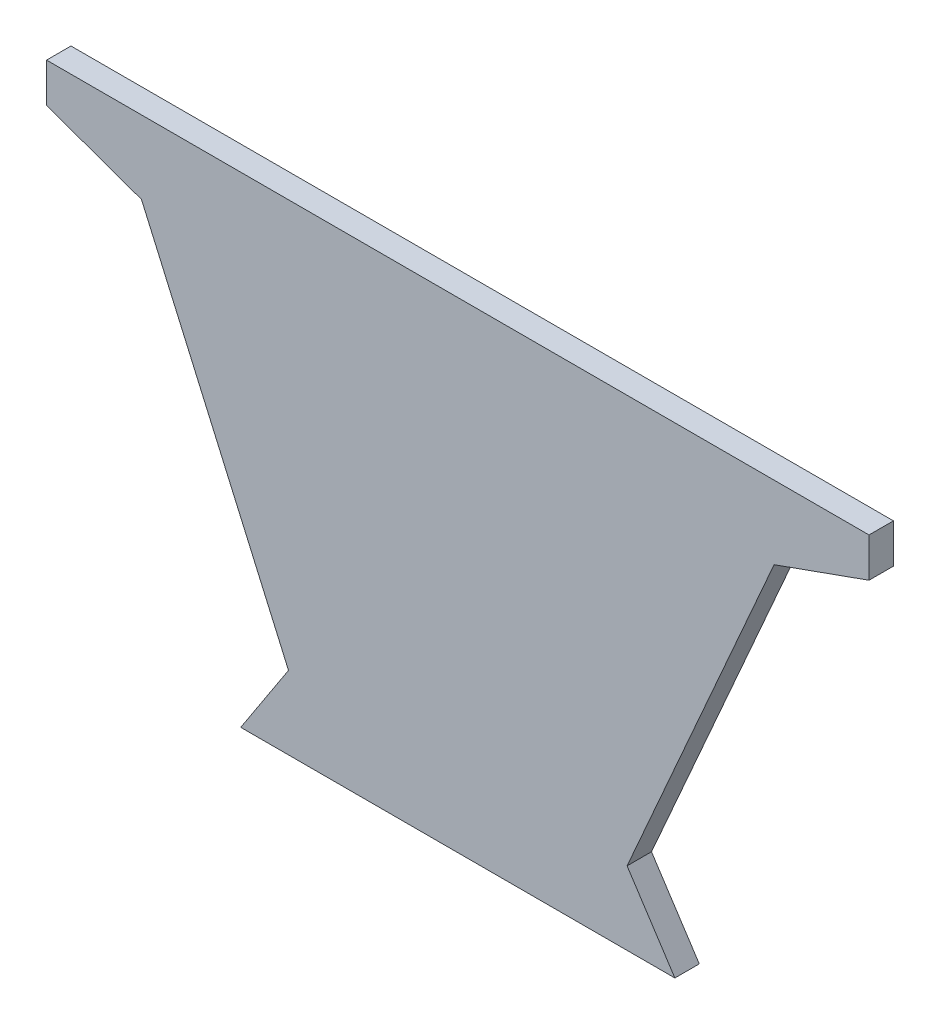
ISO-10303-21;
HEADER;
FILE_DESCRIPTION(('STEP AP214'),'2;1');
FILE_NAME('part.step','',(''),(''),'','','');
FILE_SCHEMA(('AUTOMOTIVE_DESIGN { 1 0 10303 214 1 1 1 1 }'));
ENDSEC;
DATA;
#1=APPLICATION_CONTEXT('core data for automotive mechanical design processes');
#2=APPLICATION_PROTOCOL_DEFINITION('international standard','automotive_design',2000,#1);
#3=PRODUCT_CONTEXT('',#1,'mechanical');
#4=PRODUCT('Part','Part','',(#3));
#5=PRODUCT_RELATED_PRODUCT_CATEGORY('part','',(#4));
#6=PRODUCT_DEFINITION_FORMATION('','',#4);
#7=PRODUCT_DEFINITION_CONTEXT('part definition',#1,'design');
#8=PRODUCT_DEFINITION('design','',#6,#7);
#9=PRODUCT_DEFINITION_SHAPE('','',#8);
#10=(LENGTH_UNIT() NAMED_UNIT(*) SI_UNIT(.MILLI.,.METRE.));
#11=(NAMED_UNIT(*) PLANE_ANGLE_UNIT() SI_UNIT($,.RADIAN.));
#12=(NAMED_UNIT(*) SI_UNIT($,.STERADIAN.) SOLID_ANGLE_UNIT());
#13=UNCERTAINTY_MEASURE_WITH_UNIT(LENGTH_MEASURE(1.E-05),#10,'distance_accuracy_value','');
#14=(GEOMETRIC_REPRESENTATION_CONTEXT(3) GLOBAL_UNCERTAINTY_ASSIGNED_CONTEXT((#13)) GLOBAL_UNIT_ASSIGNED_CONTEXT((#10,
#11,#12)) REPRESENTATION_CONTEXT('',''));
#15=CARTESIAN_POINT('',(0.,0.,0.));
#16=DIRECTION('',(0.,0.,1.));
#17=DIRECTION('',(1.,0.,0.));
#18=AXIS2_PLACEMENT_3D('',#15,#16,#17);
#19=CARTESIAN_POINT('',(0.,0.,5.));
#20=DIRECTION('',(0.,0.,1.));
#21=DIRECTION('',(1.,0.,0.));
#22=AXIS2_PLACEMENT_3D('',#19,#20,#21);
#23=PLANE('',#22);
#24=DIRECTION('',(0.402524691548119,-0.915409128583549,0.));
#25=VECTOR('',#24,1.);
#26=CARTESIAN_POINT('',(-41.6839180394226,-18.3292974992485,5.));
#27=LINE('',#26,#25);
#28=CARTESIAN_POINT('',(-64.8041435722949,34.25,5.));
#29=VERTEX_POINT('',#28);
#30=CARTESIAN_POINT('',(-34.6832495260328,-34.25,5.));
#31=VERTEX_POINT('',#30);
#32=EDGE_CURVE('E120',#29,#31,#27,.T.);
#33=ORIENTED_EDGE('',*,*,#32,.T.);
#34=DIRECTION('',(-0.54656898395897,-0.837414082622247,0.));
#35=VECTOR('',#34,1.);
#36=CARTESIAN_POINT('',(-8.64567559469956,5.64291695529728,5.));
#37=LINE('',#36,#35);
#38=CARTESIAN_POINT('',(-44.4735491275298,-49.25,5.));
#39=VERTEX_POINT('',#38);
#40=EDGE_CURVE('E113',#31,#39,#37,.T.);
#41=ORIENTED_EDGE('',*,*,#40,.T.);
#42=DIRECTION('',(1.,0.,0.));
#43=VECTOR('',#42,1.);
#44=CARTESIAN_POINT('',(-44.4735491275298,-49.25,5.));
#45=LINE('',#44,#43);
#46=CARTESIAN_POINT('',(44.4735491275299,-49.25,5.));
#47=VERTEX_POINT('',#46);
#48=EDGE_CURVE('E148',#39,#47,#45,.T.);
#49=ORIENTED_EDGE('',*,*,#48,.T.);
#50=DIRECTION('',(-0.54656898395897,0.837414082622247,0.));
#51=VECTOR('',#50,1.);
#52=CARTESIAN_POINT('',(8.64567559469958,5.64291695529731,5.));
#53=LINE('',#52,#51);
#54=CARTESIAN_POINT('',(34.6832495260329,-34.25,5.));
#55=VERTEX_POINT('',#54);
#56=EDGE_CURVE('E182',#47,#55,#53,.T.);
#57=ORIENTED_EDGE('',*,*,#56,.T.);
#58=DIRECTION('',(0.402524691548119,0.915409128583549,0.));
#59=VECTOR('',#58,1.);
#60=CARTESIAN_POINT('',(41.6839180394226,-18.3292974992485,5.));
#61=LINE('',#60,#59);
#62=CARTESIAN_POINT('',(64.804143572295,34.25,5.));
#63=VERTEX_POINT('',#62);
#64=EDGE_CURVE('E187',#55,#63,#61,.T.);
#65=ORIENTED_EDGE('',*,*,#64,.T.);
#66=DIRECTION('',(0.94153595264122,0.336912525567082,0.));
#67=VECTOR('',#66,1.);
#68=CARTESIAN_POINT('',(-3.50870093871182,9.805417816695,5.));
#69=LINE('',#68,#67);
#70=CARTESIAN_POINT('',(84.25,41.2083668924107,5.));
#71=VERTEX_POINT('',#70);
#72=EDGE_CURVE('E178',#63,#71,#69,.T.);
#73=ORIENTED_EDGE('',*,*,#72,.T.);
#74=DIRECTION('',(0.,1.,0.));
#75=VECTOR('',#74,1.);
#76=CARTESIAN_POINT('',(84.25,41.2083668924107,5.));
#77=LINE('',#76,#75);
#78=CARTESIAN_POINT('',(84.25,49.25,5.));
#79=VERTEX_POINT('',#78);
#80=EDGE_CURVE('E201',#71,#79,#77,.T.);
#81=ORIENTED_EDGE('',*,*,#80,.T.);
#82=DIRECTION('',(-1.,0.,0.));
#83=VECTOR('',#82,1.);
#84=CARTESIAN_POINT('',(84.25,49.25,5.));
#85=LINE('',#84,#83);
#86=CARTESIAN_POINT('',(-84.25,49.25,5.));
#87=VERTEX_POINT('',#86);
#88=EDGE_CURVE('E70',#79,#87,#85,.T.);
#89=ORIENTED_EDGE('',*,*,#88,.T.);
#90=DIRECTION('',(0.,-1.,0.));
#91=VECTOR('',#90,1.);
#92=CARTESIAN_POINT('',(-84.25,49.25,5.));
#93=LINE('',#92,#91);
#94=CARTESIAN_POINT('',(-84.25,41.2083668924108,5.));
#95=VERTEX_POINT('',#94);
#96=EDGE_CURVE('E96',#87,#95,#93,.T.);
#97=ORIENTED_EDGE('',*,*,#96,.T.);
#98=DIRECTION('',(0.94153595264122,-0.336912525567083,0.));
#99=VECTOR('',#98,1.);
#100=CARTESIAN_POINT('',(3.5087009387118,9.80541781669491,5.));
#101=LINE('',#100,#99);
#102=EDGE_CURVE('E191',#95,#29,#101,.T.);
#103=ORIENTED_EDGE('',*,*,#102,.T.);
#104=EDGE_LOOP('',(#33,#41,#49,#57,#65,#73,#81,#89,#97,#103));
#105=FACE_BOUND('',#104,.T.);
#106=ADVANCED_FACE('F45',(#105),#23,.T.);
#107=CARTESIAN_POINT('',(0.,0.,0.));
#108=DIRECTION('',(0.,0.,1.));
#109=DIRECTION('',(1.,0.,0.));
#110=AXIS2_PLACEMENT_3D('',#107,#108,#109);
#111=PLANE('',#110);
#112=DIRECTION('',(0.54656898395897,0.837414082622247,0.));
#113=VECTOR('',#112,1.);
#114=CARTESIAN_POINT('',(-8.64567559469956,5.64291695529728,0.));
#115=LINE('',#114,#113);
#116=CARTESIAN_POINT('',(-44.4735491275298,-49.25,0.));
#117=VERTEX_POINT('',#116);
#118=CARTESIAN_POINT('',(-34.6832495260328,-34.25,0.));
#119=VERTEX_POINT('',#118);
#120=EDGE_CURVE('E157',#117,#119,#115,.T.);
#121=ORIENTED_EDGE('',*,*,#120,.T.);
#122=DIRECTION('',(-0.402524691548119,0.915409128583548,0.));
#123=VECTOR('',#122,1.);
#124=CARTESIAN_POINT('',(-41.6839180394226,-18.3292974992485,0.));
#125=LINE('',#124,#123);
#126=CARTESIAN_POINT('',(-64.8041435722949,34.25,0.));
#127=VERTEX_POINT('',#126);
#128=EDGE_CURVE('E240',#119,#127,#125,.T.);
#129=ORIENTED_EDGE('',*,*,#128,.T.);
#130=DIRECTION('',(-0.94153595264122,0.336912525567083,0.));
#131=VECTOR('',#130,1.);
#132=CARTESIAN_POINT('',(3.5087009387118,9.80541781669491,0.));
#133=LINE('',#132,#131);
#134=CARTESIAN_POINT('',(-84.25,41.2083668924108,0.));
#135=VERTEX_POINT('',#134);
#136=EDGE_CURVE('E110',#127,#135,#133,.T.);
#137=ORIENTED_EDGE('',*,*,#136,.T.);
#138=DIRECTION('',(0.,-1.,0.));
#139=VECTOR('',#138,1.);
#140=CARTESIAN_POINT('',(-84.25,49.25,0.));
#141=LINE('',#140,#139);
#142=CARTESIAN_POINT('',(-84.25,49.25,0.));
#143=VERTEX_POINT('',#142);
#144=EDGE_CURVE('E102',#143,#135,#141,.T.);
#145=ORIENTED_EDGE('',*,*,#144,.F.);
#146=DIRECTION('',(-1.,0.,0.));
#147=VECTOR('',#146,1.);
#148=CARTESIAN_POINT('',(84.25,49.25,0.));
#149=LINE('',#148,#147);
#150=CARTESIAN_POINT('',(84.25,49.25,0.));
#151=VERTEX_POINT('',#150);
#152=EDGE_CURVE('E85',#151,#143,#149,.T.);
#153=ORIENTED_EDGE('',*,*,#152,.F.);
#154=DIRECTION('',(0.,1.,0.));
#155=VECTOR('',#154,1.);
#156=CARTESIAN_POINT('',(84.25,41.2083668924107,0.));
#157=LINE('',#156,#155);
#158=CARTESIAN_POINT('',(84.25,41.2083668924107,0.));
#159=VERTEX_POINT('',#158);
#160=EDGE_CURVE('E97',#159,#151,#157,.T.);
#161=ORIENTED_EDGE('',*,*,#160,.F.);
#162=DIRECTION('',(-0.94153595264122,-0.336912525567082,0.));
#163=VECTOR('',#162,1.);
#164=CARTESIAN_POINT('',(-3.50870093871182,9.805417816695,0.));
#165=LINE('',#164,#163);
#166=CARTESIAN_POINT('',(64.804143572295,34.25,0.));
#167=VERTEX_POINT('',#166);
#168=EDGE_CURVE('E167',#159,#167,#165,.T.);
#169=ORIENTED_EDGE('',*,*,#168,.T.);
#170=DIRECTION('',(-0.402524691548119,-0.915409128583549,0.));
#171=VECTOR('',#170,1.);
#172=CARTESIAN_POINT('',(41.6839180394226,-18.3292974992485,0.));
#173=LINE('',#172,#171);
#174=CARTESIAN_POINT('',(34.6832495260329,-34.25,0.));
#175=VERTEX_POINT('',#174);
#176=EDGE_CURVE('E61',#167,#175,#173,.T.);
#177=ORIENTED_EDGE('',*,*,#176,.T.);
#178=DIRECTION('',(0.54656898395897,-0.837414082622247,0.));
#179=VECTOR('',#178,1.);
#180=CARTESIAN_POINT('',(8.64567559469958,5.64291695529731,0.));
#181=LINE('',#180,#179);
#182=CARTESIAN_POINT('',(44.4735491275299,-49.25,0.));
#183=VERTEX_POINT('',#182);
#184=EDGE_CURVE('E159',#175,#183,#181,.T.);
#185=ORIENTED_EDGE('',*,*,#184,.T.);
#186=DIRECTION('',(1.,0.,0.));
#187=VECTOR('',#186,1.);
#188=CARTESIAN_POINT('',(-44.4735491275298,-49.25,0.));
#189=LINE('',#188,#187);
#190=EDGE_CURVE('E112',#117,#183,#189,.T.);
#191=ORIENTED_EDGE('',*,*,#190,.F.);
#192=EDGE_LOOP('',(#121,#129,#137,#145,#153,#161,#169,#177,#185,#191));
#193=FACE_BOUND('',#192,.T.);
#194=ADVANCED_FACE('F107',(#193),#111,.F.);
#195=CARTESIAN_POINT('',(-84.25,49.25,5.));
#196=DIRECTION('',(1.,0.,0.));
#197=DIRECTION('',(0.,0.,-1.));
#198=AXIS2_PLACEMENT_3D('',#195,#196,#197);
#199=PLANE('',#198);
#200=ORIENTED_EDGE('',*,*,#144,.T.);
#201=DIRECTION('',(0.,0.,-1.));
#202=VECTOR('',#201,1.);
#203=CARTESIAN_POINT('',(-84.25,41.2083668924108,5.));
#204=LINE('',#203,#202);
#205=EDGE_CURVE('E11',#95,#135,#204,.T.);
#206=ORIENTED_EDGE('',*,*,#205,.F.);
#207=ORIENTED_EDGE('',*,*,#96,.F.);
#208=DIRECTION('',(0.,0.,-1.));
#209=VECTOR('',#208,1.);
#210=CARTESIAN_POINT('',(-84.25,49.25,5.));
#211=LINE('',#210,#209);
#212=EDGE_CURVE('E88',#87,#143,#211,.T.);
#213=ORIENTED_EDGE('',*,*,#212,.T.);
#214=EDGE_LOOP('',(#200,#206,#207,#213));
#215=FACE_BOUND('',#214,.T.);
#216=ADVANCED_FACE('F47',(#215),#199,.F.);
#217=CARTESIAN_POINT('',(-44.4735491275298,-49.25,5.));
#218=DIRECTION('',(0.,1.,0.));
#219=DIRECTION('',(0.,0.,1.));
#220=AXIS2_PLACEMENT_3D('',#217,#218,#219);
#221=PLANE('',#220);
#222=ORIENTED_EDGE('',*,*,#190,.T.);
#223=DIRECTION('',(0.,0.,-1.));
#224=VECTOR('',#223,1.);
#225=CARTESIAN_POINT('',(44.4735491275299,-49.25,5.));
#226=LINE('',#225,#224);
#227=EDGE_CURVE('E133',#47,#183,#226,.T.);
#228=ORIENTED_EDGE('',*,*,#227,.F.);
#229=ORIENTED_EDGE('',*,*,#48,.F.);
#230=DIRECTION('',(0.,0.,-1.));
#231=VECTOR('',#230,1.);
#232=CARTESIAN_POINT('',(-44.4735491275298,-49.25,5.));
#233=LINE('',#232,#231);
#234=EDGE_CURVE('E54',#39,#117,#233,.T.);
#235=ORIENTED_EDGE('',*,*,#234,.T.);
#236=EDGE_LOOP('',(#222,#228,#229,#235));
#237=FACE_BOUND('',#236,.T.);
#238=ADVANCED_FACE('F143',(#237),#221,.F.);
#239=CARTESIAN_POINT('',(84.25,41.2083668924107,5.));
#240=DIRECTION('',(-1.,0.,0.));
#241=DIRECTION('',(0.,0.,1.));
#242=AXIS2_PLACEMENT_3D('',#239,#240,#241);
#243=PLANE('',#242);
#244=ORIENTED_EDGE('',*,*,#160,.T.);
#245=DIRECTION('',(0.,0.,-1.));
#246=VECTOR('',#245,1.);
#247=CARTESIAN_POINT('',(84.25,49.25,5.));
#248=LINE('',#247,#246);
#249=EDGE_CURVE('E91',#79,#151,#248,.T.);
#250=ORIENTED_EDGE('',*,*,#249,.F.);
#251=ORIENTED_EDGE('',*,*,#80,.F.);
#252=DIRECTION('',(0.,0.,-1.));
#253=VECTOR('',#252,1.);
#254=CARTESIAN_POINT('',(84.25,41.2083668924107,5.));
#255=LINE('',#254,#253);
#256=EDGE_CURVE('E129',#71,#159,#255,.T.);
#257=ORIENTED_EDGE('',*,*,#256,.T.);
#258=EDGE_LOOP('',(#244,#250,#251,#257));
#259=FACE_BOUND('',#258,.T.);
#260=ADVANCED_FACE('F208',(#259),#243,.F.);
#261=CARTESIAN_POINT('',(84.25,49.25,5.));
#262=DIRECTION('',(0.,-1.,0.));
#263=DIRECTION('',(1.,0.,0.));
#264=AXIS2_PLACEMENT_3D('',#261,#262,#263);
#265=PLANE('',#264);
#266=ORIENTED_EDGE('',*,*,#152,.T.);
#267=ORIENTED_EDGE('',*,*,#212,.F.);
#268=ORIENTED_EDGE('',*,*,#88,.F.);
#269=ORIENTED_EDGE('',*,*,#249,.T.);
#270=EDGE_LOOP('',(#266,#267,#268,#269));
#271=FACE_BOUND('',#270,.T.);
#272=ADVANCED_FACE('F87',(#271),#265,.F.);
#273=CARTESIAN_POINT('',(41.6839180394226,-18.3292974992485,10.));
#274=DIRECTION('',(0.915409128583549,-0.402524691548119,0.));
#275=DIRECTION('',(0.402524691548119,0.915409128583549,0.));
#276=AXIS2_PLACEMENT_3D('',#273,#274,#275);
#277=PLANE('',#276);
#278=DIRECTION('',(0.,0.,-1.));
#279=VECTOR('',#278,1.);
#280=CARTESIAN_POINT('',(34.6832495260329,-34.25,10.));
#281=LINE('',#280,#279);
#282=EDGE_CURVE('E171',#55,#175,#281,.T.);
#283=ORIENTED_EDGE('',*,*,#282,.T.);
#284=ORIENTED_EDGE('',*,*,#176,.F.);
#285=DIRECTION('',(0.,0.,-1.));
#286=VECTOR('',#285,1.);
#287=CARTESIAN_POINT('',(64.804143572295,34.25,10.));
#288=LINE('',#287,#286);
#289=EDGE_CURVE('E166',#63,#167,#288,.T.);
#290=ORIENTED_EDGE('',*,*,#289,.F.);
#291=ORIENTED_EDGE('',*,*,#64,.F.);
#292=EDGE_LOOP('',(#283,#284,#290,#291));
#293=FACE_BOUND('',#292,.T.);
#294=ADVANCED_FACE('F270',(#293),#277,.T.);
#295=CARTESIAN_POINT('',(8.64567559469958,5.64291695529731,10.));
#296=DIRECTION('',(0.837414082622247,0.54656898395897,0.));
#297=DIRECTION('',(-0.54656898395897,0.837414082622247,0.));
#298=AXIS2_PLACEMENT_3D('',#295,#296,#297);
#299=PLANE('',#298);
#300=ORIENTED_EDGE('',*,*,#227,.T.);
#301=ORIENTED_EDGE('',*,*,#184,.F.);
#302=ORIENTED_EDGE('',*,*,#282,.F.);
#303=ORIENTED_EDGE('',*,*,#56,.F.);
#304=EDGE_LOOP('',(#300,#301,#302,#303));
#305=FACE_BOUND('',#304,.T.);
#306=ADVANCED_FACE('F305',(#305),#299,.T.);
#307=CARTESIAN_POINT('',(-3.50870093871182,9.805417816695,10.));
#308=DIRECTION('',(0.336912525567082,-0.94153595264122,0.));
#309=DIRECTION('',(0.94153595264122,0.336912525567082,0.));
#310=AXIS2_PLACEMENT_3D('',#307,#308,#309);
#311=PLANE('',#310);
#312=ORIENTED_EDGE('',*,*,#289,.T.);
#313=ORIENTED_EDGE('',*,*,#168,.F.);
#314=ORIENTED_EDGE('',*,*,#256,.F.);
#315=ORIENTED_EDGE('',*,*,#72,.F.);
#316=EDGE_LOOP('',(#312,#313,#314,#315));
#317=FACE_BOUND('',#316,.T.);
#318=ADVANCED_FACE('F313',(#317),#311,.T.);
#319=CARTESIAN_POINT('',(-8.64567559469956,5.64291695529728,10.));
#320=DIRECTION('',(-0.837414082622247,0.54656898395897,0.));
#321=DIRECTION('',(-0.54656898395897,-0.837414082622247,0.));
#322=AXIS2_PLACEMENT_3D('',#319,#320,#321);
#323=PLANE('',#322);
#324=DIRECTION('',(0.,0.,-1.));
#325=VECTOR('',#324,1.);
#326=CARTESIAN_POINT('',(-34.6832495260328,-34.25,10.));
#327=LINE('',#326,#325);
#328=EDGE_CURVE('E183',#31,#119,#327,.T.);
#329=ORIENTED_EDGE('',*,*,#328,.T.);
#330=ORIENTED_EDGE('',*,*,#120,.F.);
#331=ORIENTED_EDGE('',*,*,#234,.F.);
#332=ORIENTED_EDGE('',*,*,#40,.F.);
#333=EDGE_LOOP('',(#329,#330,#331,#332));
#334=FACE_BOUND('',#333,.T.);
#335=ADVANCED_FACE('F234',(#334),#323,.T.);
#336=CARTESIAN_POINT('',(-41.6839180394226,-18.3292974992485,10.));
#337=DIRECTION('',(-0.915409128583548,-0.402524691548119,0.));
#338=DIRECTION('',(0.402524691548119,-0.915409128583549,0.));
#339=AXIS2_PLACEMENT_3D('',#336,#337,#338);
#340=PLANE('',#339);
#341=DIRECTION('',(0.,0.,-1.));
#342=VECTOR('',#341,1.);
#343=CARTESIAN_POINT('',(-64.8041435722949,34.25,10.));
#344=LINE('',#343,#342);
#345=EDGE_CURVE('E242',#29,#127,#344,.T.);
#346=ORIENTED_EDGE('',*,*,#345,.T.);
#347=ORIENTED_EDGE('',*,*,#128,.F.);
#348=ORIENTED_EDGE('',*,*,#328,.F.);
#349=ORIENTED_EDGE('',*,*,#32,.F.);
#350=EDGE_LOOP('',(#346,#347,#348,#349));
#351=FACE_BOUND('',#350,.T.);
#352=ADVANCED_FACE('F238',(#351),#340,.T.);
#353=CARTESIAN_POINT('',(3.5087009387118,9.80541781669491,10.));
#354=DIRECTION('',(-0.336912525567083,-0.94153595264122,0.));
#355=DIRECTION('',(0.94153595264122,-0.336912525567083,0.));
#356=AXIS2_PLACEMENT_3D('',#353,#354,#355);
#357=PLANE('',#356);
#358=ORIENTED_EDGE('',*,*,#205,.T.);
#359=ORIENTED_EDGE('',*,*,#136,.F.);
#360=ORIENTED_EDGE('',*,*,#345,.F.);
#361=ORIENTED_EDGE('',*,*,#102,.F.);
#362=EDGE_LOOP('',(#358,#359,#360,#361));
#363=FACE_BOUND('',#362,.T.);
#364=ADVANCED_FACE('F245',(#363),#357,.T.);
#365=CLOSED_SHELL('',(#106,#194,#216,#238,#260,#272,#294,#306,#318,#335,#352,#364));
#366=MANIFOLD_SOLID_BREP('B2',#365);
#367=ADVANCED_BREP_SHAPE_REPRESENTATION('',(#18,#366),#14);
#368=SHAPE_DEFINITION_REPRESENTATION(#9,#367);
ENDSEC;
END-ISO-10303-21;
